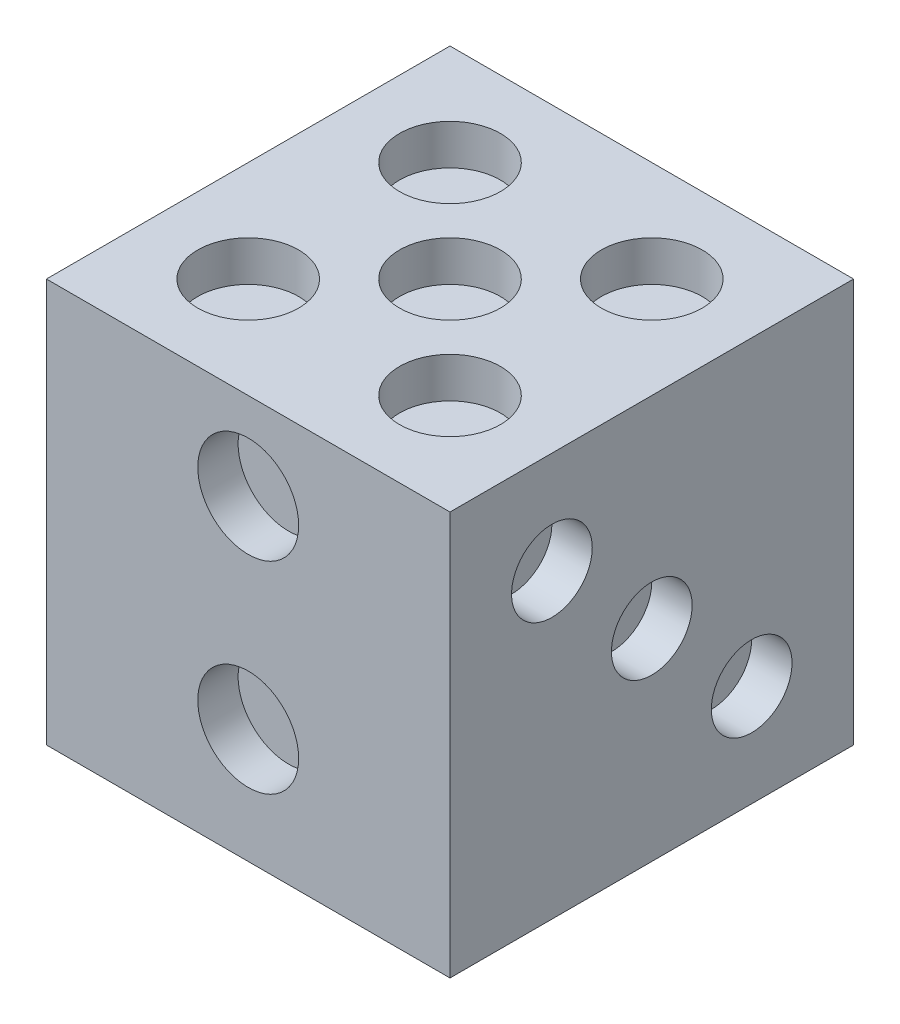
ISO-10303-21;
HEADER;
FILE_DESCRIPTION(('STEP AP214'),'2;1');
FILE_NAME('part.step','',(''),(''),'','','');
FILE_SCHEMA(('AUTOMOTIVE_DESIGN { 1 0 10303 214 1 1 1 1 }'));
ENDSEC;
DATA;
#1=APPLICATION_CONTEXT('core data for automotive mechanical design processes');
#2=APPLICATION_PROTOCOL_DEFINITION('international standard','automotive_design',2000,#1);
#3=PRODUCT_CONTEXT('',#1,'mechanical');
#4=PRODUCT('Part','Part','',(#3));
#5=PRODUCT_RELATED_PRODUCT_CATEGORY('part','',(#4));
#6=PRODUCT_DEFINITION_FORMATION('','',#4);
#7=PRODUCT_DEFINITION_CONTEXT('part definition',#1,'design');
#8=PRODUCT_DEFINITION('design','',#6,#7);
#9=PRODUCT_DEFINITION_SHAPE('','',#8);
#10=(LENGTH_UNIT() NAMED_UNIT(*) SI_UNIT(.MILLI.,.METRE.));
#11=(NAMED_UNIT(*) PLANE_ANGLE_UNIT() SI_UNIT($,.RADIAN.));
#12=(NAMED_UNIT(*) SI_UNIT($,.STERADIAN.) SOLID_ANGLE_UNIT());
#13=UNCERTAINTY_MEASURE_WITH_UNIT(LENGTH_MEASURE(1.E-05),#10,'distance_accuracy_value','');
#14=(GEOMETRIC_REPRESENTATION_CONTEXT(3) GLOBAL_UNCERTAINTY_ASSIGNED_CONTEXT((#13)) GLOBAL_UNIT_ASSIGNED_CONTEXT((#10,
#11,#12)) REPRESENTATION_CONTEXT('',''));
#15=CARTESIAN_POINT('',(0.,0.,0.));
#16=DIRECTION('',(0.,0.,1.));
#17=DIRECTION('',(1.,0.,0.));
#18=AXIS2_PLACEMENT_3D('',#15,#16,#17);
#19=CARTESIAN_POINT('',(-40.9403691906033,100.,52.2269008412575));
#20=DIRECTION('',(-1.,0.,0.));
#21=DIRECTION('',(0.,0.,1.));
#22=AXIS2_PLACEMENT_3D('',#19,#20,#21);
#23=PLANE('',#22);
#24=CARTESIAN_POINT('',(-40.9403691906033,73.7094093763666,-22.7730991587426));
#25=DIRECTION('',(-1.,0.,0.));
#26=DIRECTION('',(0.,0.,1.));
#27=AXIS2_PLACEMENT_3D('',#24,#25,#26);
#28=CIRCLE('',#27,12.);
#29=CARTESIAN_POINT('',(-40.9403691906033,73.7094093763666,-10.7730991587426));
#30=VERTEX_POINT('',#29);
#31=EDGE_CURVE('E143',#30,#30,#28,.T.);
#32=ORIENTED_EDGE('',*,*,#31,.F.);
#33=EDGE_LOOP('',(#32));
#34=FACE_BOUND('',#33,.T.);
#35=CARTESIAN_POINT('',(-40.9403691906033,75.,2.22690084125745));
#36=DIRECTION('',(-1.,0.,0.));
#37=DIRECTION('',(0.,0.,1.));
#38=AXIS2_PLACEMENT_3D('',#35,#36,#37);
#39=CIRCLE('',#38,12.);
#40=CARTESIAN_POINT('',(-40.9403691906033,75.,14.2269008412575));
#41=VERTEX_POINT('',#40);
#42=EDGE_CURVE('E147',#41,#41,#39,.T.);
#43=ORIENTED_EDGE('',*,*,#42,.F.);
#44=EDGE_LOOP('',(#43));
#45=FACE_BOUND('',#44,.T.);
#46=CARTESIAN_POINT('',(-40.9403691906033,75.,27.2269008412575));
#47=DIRECTION('',(-1.,0.,0.));
#48=DIRECTION('',(0.,0.,1.));
#49=AXIS2_PLACEMENT_3D('',#46,#47,#48);
#50=CIRCLE('',#49,12.);
#51=CARTESIAN_POINT('',(-40.9403691906033,75.,39.2269008412574));
#52=VERTEX_POINT('',#51);
#53=EDGE_CURVE('E151',#52,#52,#50,.T.);
#54=ORIENTED_EDGE('',*,*,#53,.F.);
#55=EDGE_LOOP('',(#54));
#56=FACE_BOUND('',#55,.T.);
#57=CARTESIAN_POINT('',(-40.9403691906033,25.,27.2269008412575));
#58=DIRECTION('',(-1.,0.,0.));
#59=DIRECTION('',(0.,0.,1.));
#60=AXIS2_PLACEMENT_3D('',#57,#58,#59);
#61=CIRCLE('',#60,12.);
#62=CARTESIAN_POINT('',(-40.9403691906033,25.,39.2269008412574));
#63=VERTEX_POINT('',#62);
#64=EDGE_CURVE('E155',#63,#63,#61,.T.);
#65=ORIENTED_EDGE('',*,*,#64,.F.);
#66=EDGE_LOOP('',(#65));
#67=FACE_BOUND('',#66,.T.);
#68=CARTESIAN_POINT('',(-40.9403691906033,25.,2.22690084125745));
#69=DIRECTION('',(-1.,0.,0.));
#70=DIRECTION('',(0.,0.,1.));
#71=AXIS2_PLACEMENT_3D('',#68,#69,#70);
#72=CIRCLE('',#71,12.);
#73=CARTESIAN_POINT('',(-40.9403691906033,25.,14.2269008412575));
#74=VERTEX_POINT('',#73);
#75=EDGE_CURVE('E159',#74,#74,#72,.T.);
#76=ORIENTED_EDGE('',*,*,#75,.F.);
#77=EDGE_LOOP('',(#76));
#78=FACE_BOUND('',#77,.T.);
#79=CARTESIAN_POINT('',(-40.9403691906033,25.,-22.7730991587426));
#80=DIRECTION('',(-1.,0.,0.));
#81=DIRECTION('',(0.,0.,1.));
#82=AXIS2_PLACEMENT_3D('',#79,#80,#81);
#83=CIRCLE('',#82,12.);
#84=CARTESIAN_POINT('',(-40.9403691906033,25.,-10.7730991587426));
#85=VERTEX_POINT('',#84);
#86=EDGE_CURVE('E162',#85,#85,#83,.T.);
#87=ORIENTED_EDGE('',*,*,#86,.F.);
#88=EDGE_LOOP('',(#87));
#89=FACE_BOUND('',#88,.T.);
#90=DIRECTION('',(0.,0.,-1.));
#91=VECTOR('',#90,1.);
#92=CARTESIAN_POINT('',(-40.9403691906033,0.,52.2269008412575));
#93=LINE('',#92,#91);
#94=CARTESIAN_POINT('',(-40.9403691906033,0.,52.2269008412575));
#95=VERTEX_POINT('',#94);
#96=CARTESIAN_POINT('',(-40.9403691906033,0.,-47.7730991587426));
#97=VERTEX_POINT('',#96);
#98=EDGE_CURVE('E116',#95,#97,#93,.T.);
#99=ORIENTED_EDGE('',*,*,#98,.F.);
#100=DIRECTION('',(0.,-1.,0.));
#101=VECTOR('',#100,1.);
#102=CARTESIAN_POINT('',(-40.9403691906033,100.,52.2269008412575));
#103=LINE('',#102,#101);
#104=CARTESIAN_POINT('',(-40.9403691906033,100.,52.2269008412575));
#105=VERTEX_POINT('',#104);
#106=EDGE_CURVE('E12',#105,#95,#103,.T.);
#107=ORIENTED_EDGE('',*,*,#106,.F.);
#108=DIRECTION('',(0.,0.,-1.));
#109=VECTOR('',#108,1.);
#110=CARTESIAN_POINT('',(-40.9403691906033,100.,52.2269008412575));
#111=LINE('',#110,#109);
#112=CARTESIAN_POINT('',(-40.9403691906033,100.,-47.7730991587426));
#113=VERTEX_POINT('',#112);
#114=EDGE_CURVE('E108',#105,#113,#111,.T.);
#115=ORIENTED_EDGE('',*,*,#114,.T.);
#116=DIRECTION('',(0.,-1.,0.));
#117=VECTOR('',#116,1.);
#118=CARTESIAN_POINT('',(-40.9403691906033,100.,-47.7730991587426));
#119=LINE('',#118,#117);
#120=EDGE_CURVE('E47',#113,#97,#119,.T.);
#121=ORIENTED_EDGE('',*,*,#120,.T.);
#122=EDGE_LOOP('',(#99,#107,#115,#121));
#123=FACE_BOUND('',#122,.T.);
#124=ADVANCED_FACE('F44',(#34,#45,#56,#67,#78,#89,#123),#23,.T.);
#125=CARTESIAN_POINT('',(-40.9403691906033,100.,52.2269008412575));
#126=DIRECTION('',(0.,0.,-1.));
#127=DIRECTION('',(-1.,0.,0.));
#128=AXIS2_PLACEMENT_3D('',#125,#126,#127);
#129=PLANE('',#128);
#130=CARTESIAN_POINT('',(9.05963080939674,78.3884909162886,52.2269008412575));
#131=DIRECTION('',(0.,0.,1.));
#132=DIRECTION('',(1.,0.,0.));
#133=AXIS2_PLACEMENT_3D('',#130,#131,#132);
#134=CIRCLE('',#133,12.5);
#135=CARTESIAN_POINT('',(21.5596308093967,78.3884909162886,52.2269008412575));
#136=VERTEX_POINT('',#135);
#137=EDGE_CURVE('E181',#136,#136,#134,.T.);
#138=ORIENTED_EDGE('',*,*,#137,.F.);
#139=EDGE_LOOP('',(#138));
#140=FACE_BOUND('',#139,.T.);
#141=CARTESIAN_POINT('',(9.05963080939674,28.3884909162886,52.2269008412575));
#142=DIRECTION('',(0.,0.,1.));
#143=DIRECTION('',(1.,0.,0.));
#144=AXIS2_PLACEMENT_3D('',#141,#142,#143);
#145=CIRCLE('',#144,12.5);
#146=CARTESIAN_POINT('',(21.5596308093967,28.3884909162886,52.2269008412575));
#147=VERTEX_POINT('',#146);
#148=EDGE_CURVE('E170',#147,#147,#145,.T.);
#149=ORIENTED_EDGE('',*,*,#148,.F.);
#150=EDGE_LOOP('',(#149));
#151=FACE_BOUND('',#150,.T.);
#152=DIRECTION('',(1.,0.,0.));
#153=VECTOR('',#152,1.);
#154=CARTESIAN_POINT('',(-40.9403691906033,0.,52.2269008412575));
#155=LINE('',#154,#153);
#156=CARTESIAN_POINT('',(59.0596308093967,0.,52.2269008412575));
#157=VERTEX_POINT('',#156);
#158=EDGE_CURVE('E78',#95,#157,#155,.T.);
#159=ORIENTED_EDGE('',*,*,#158,.T.);
#160=DIRECTION('',(0.,-1.,0.));
#161=VECTOR('',#160,1.);
#162=CARTESIAN_POINT('',(59.0596308093967,100.,52.2269008412575));
#163=LINE('',#162,#161);
#164=CARTESIAN_POINT('',(59.0596308093967,100.,52.2269008412575));
#165=VERTEX_POINT('',#164);
#166=EDGE_CURVE('E54',#165,#157,#163,.T.);
#167=ORIENTED_EDGE('',*,*,#166,.F.);
#168=DIRECTION('',(1.,0.,0.));
#169=VECTOR('',#168,1.);
#170=CARTESIAN_POINT('',(-40.9403691906033,100.,52.2269008412575));
#171=LINE('',#170,#169);
#172=EDGE_CURVE('E95',#105,#165,#171,.T.);
#173=ORIENTED_EDGE('',*,*,#172,.F.);
#174=ORIENTED_EDGE('',*,*,#106,.T.);
#175=EDGE_LOOP('',(#159,#167,#173,#174));
#176=FACE_BOUND('',#175,.T.);
#177=ADVANCED_FACE('F133',(#140,#151,#176),#129,.F.);
#178=CARTESIAN_POINT('',(59.0596308093967,100.,52.2269008412575));
#179=DIRECTION('',(-1.,0.,0.));
#180=DIRECTION('',(0.,0.,1.));
#181=AXIS2_PLACEMENT_3D('',#178,#179,#180);
#182=PLANE('',#181);
#183=CARTESIAN_POINT('',(59.0596308093967,74.7487373415292,26.9756381827866));
#184=DIRECTION('',(1.,0.,0.));
#185=DIRECTION('',(0.,0.,-1.));
#186=AXIS2_PLACEMENT_3D('',#183,#184,#185);
#187=CIRCLE('',#186,10.);
#188=CARTESIAN_POINT('',(59.0596308093967,74.7487373415292,16.9756381827866));
#189=VERTEX_POINT('',#188);
#190=EDGE_CURVE('E260',#189,#189,#187,.T.);
#191=ORIENTED_EDGE('',*,*,#190,.F.);
#192=EDGE_LOOP('',(#191));
#193=FACE_BOUND('',#192,.T.);
#194=CARTESIAN_POINT('',(59.0596308093967,25.2512626584708,-22.5218365002717));
#195=DIRECTION('',(1.,0.,0.));
#196=DIRECTION('',(0.,0.,-1.));
#197=AXIS2_PLACEMENT_3D('',#194,#195,#196);
#198=CIRCLE('',#197,10.);
#199=CARTESIAN_POINT('',(59.0596308093967,25.2512626584708,-32.5218365002717));
#200=VERTEX_POINT('',#199);
#201=EDGE_CURVE('E269',#200,#200,#198,.T.);
#202=ORIENTED_EDGE('',*,*,#201,.F.);
#203=EDGE_LOOP('',(#202));
#204=FACE_BOUND('',#203,.T.);
#205=CARTESIAN_POINT('',(59.0596308093967,50.,2.22690084125744));
#206=DIRECTION('',(1.,0.,0.));
#207=DIRECTION('',(0.,0.,-1.));
#208=AXIS2_PLACEMENT_3D('',#205,#206,#207);
#209=CIRCLE('',#208,10.);
#210=CARTESIAN_POINT('',(59.0596308093967,50.,-7.77309915874256));
#211=VERTEX_POINT('',#210);
#212=EDGE_CURVE('E268',#211,#211,#209,.T.);
#213=ORIENTED_EDGE('',*,*,#212,.F.);
#214=EDGE_LOOP('',(#213));
#215=FACE_BOUND('',#214,.T.);
#216=DIRECTION('',(0.,0.,-1.));
#217=VECTOR('',#216,1.);
#218=CARTESIAN_POINT('',(59.0596308093967,0.,52.2269008412575));
#219=LINE('',#218,#217);
#220=CARTESIAN_POINT('',(59.0596308093967,0.,-47.7730991587426));
#221=VERTEX_POINT('',#220);
#222=EDGE_CURVE('E103',#157,#221,#219,.T.);
#223=ORIENTED_EDGE('',*,*,#222,.T.);
#224=DIRECTION('',(0.,-1.,0.));
#225=VECTOR('',#224,1.);
#226=CARTESIAN_POINT('',(59.0596308093967,100.,-47.7730991587426));
#227=LINE('',#226,#225);
#228=CARTESIAN_POINT('',(59.0596308093967,100.,-47.7730991587426));
#229=VERTEX_POINT('',#228);
#230=EDGE_CURVE('E100',#229,#221,#227,.T.);
#231=ORIENTED_EDGE('',*,*,#230,.F.);
#232=DIRECTION('',(0.,0.,-1.));
#233=VECTOR('',#232,1.);
#234=CARTESIAN_POINT('',(59.0596308093967,100.,52.2269008412575));
#235=LINE('',#234,#233);
#236=EDGE_CURVE('E90',#165,#229,#235,.T.);
#237=ORIENTED_EDGE('',*,*,#236,.F.);
#238=ORIENTED_EDGE('',*,*,#166,.T.);
#239=EDGE_LOOP('',(#223,#231,#237,#238));
#240=FACE_BOUND('',#239,.T.);
#241=ADVANCED_FACE('F101',(#193,#204,#215,#240),#182,.F.);
#242=CARTESIAN_POINT('',(-40.9403691906033,100.,-47.7730991587426));
#243=DIRECTION('',(0.,0.,-1.));
#244=DIRECTION('',(-1.,0.,0.));
#245=AXIS2_PLACEMENT_3D('',#242,#243,#244);
#246=PLANE('',#245);
#247=CARTESIAN_POINT('',(-15.9403691906033,75.,-47.7730991587426));
#248=DIRECTION('',(0.,0.,-1.));
#249=DIRECTION('',(-1.,0.,0.));
#250=AXIS2_PLACEMENT_3D('',#247,#248,#249);
#251=CIRCLE('',#250,12.5);
#252=CARTESIAN_POINT('',(-28.4403691906033,75.,-47.7730991587426));
#253=VERTEX_POINT('',#252);
#254=EDGE_CURVE('E245',#253,#253,#251,.T.);
#255=ORIENTED_EDGE('',*,*,#254,.F.);
#256=EDGE_LOOP('',(#255));
#257=FACE_BOUND('',#256,.T.);
#258=CARTESIAN_POINT('',(34.0596308093967,25.,-47.7730991587426));
#259=DIRECTION('',(0.,0.,-1.));
#260=DIRECTION('',(-1.,0.,0.));
#261=AXIS2_PLACEMENT_3D('',#258,#259,#260);
#262=CIRCLE('',#261,12.5);
#263=CARTESIAN_POINT('',(21.5596308093967,25.,-47.7730991587426));
#264=VERTEX_POINT('',#263);
#265=EDGE_CURVE('E236',#264,#264,#262,.T.);
#266=ORIENTED_EDGE('',*,*,#265,.F.);
#267=EDGE_LOOP('',(#266));
#268=FACE_BOUND('',#267,.T.);
#269=CARTESIAN_POINT('',(-15.9403691906033,25.,-47.7730991587426));
#270=DIRECTION('',(0.,0.,-1.));
#271=DIRECTION('',(-1.,0.,0.));
#272=AXIS2_PLACEMENT_3D('',#269,#270,#271);
#273=CIRCLE('',#272,12.5);
#274=CARTESIAN_POINT('',(-28.4403691906033,25.,-47.7730991587426));
#275=VERTEX_POINT('',#274);
#276=EDGE_CURVE('E228',#275,#275,#273,.T.);
#277=ORIENTED_EDGE('',*,*,#276,.F.);
#278=EDGE_LOOP('',(#277));
#279=FACE_BOUND('',#278,.T.);
#280=CARTESIAN_POINT('',(34.0596308093967,75.,-47.7730991587426));
#281=DIRECTION('',(0.,0.,-1.));
#282=DIRECTION('',(-1.,0.,0.));
#283=AXIS2_PLACEMENT_3D('',#280,#281,#282);
#284=CIRCLE('',#283,12.5);
#285=CARTESIAN_POINT('',(21.5596308093967,75.,-47.7730991587426));
#286=VERTEX_POINT('',#285);
#287=EDGE_CURVE('E244',#286,#286,#284,.T.);
#288=ORIENTED_EDGE('',*,*,#287,.F.);
#289=EDGE_LOOP('',(#288));
#290=FACE_BOUND('',#289,.T.);
#291=DIRECTION('',(1.,0.,0.));
#292=VECTOR('',#291,1.);
#293=CARTESIAN_POINT('',(-40.9403691906033,0.,-47.7730991587426));
#294=LINE('',#293,#292);
#295=EDGE_CURVE('E120',#97,#221,#294,.T.);
#296=ORIENTED_EDGE('',*,*,#295,.F.);
#297=ORIENTED_EDGE('',*,*,#120,.F.);
#298=DIRECTION('',(1.,0.,0.));
#299=VECTOR('',#298,1.);
#300=CARTESIAN_POINT('',(-40.9403691906033,100.,-47.7730991587426));
#301=LINE('',#300,#299);
#302=EDGE_CURVE('E94',#113,#229,#301,.T.);
#303=ORIENTED_EDGE('',*,*,#302,.T.);
#304=ORIENTED_EDGE('',*,*,#230,.T.);
#305=EDGE_LOOP('',(#296,#297,#303,#304));
#306=FACE_BOUND('',#305,.T.);
#307=ADVANCED_FACE('F106',(#257,#268,#279,#290,#306),#246,.T.);
#308=CARTESIAN_POINT('',(0.,100.,0.));
#309=DIRECTION('',(0.,-1.,0.));
#310=DIRECTION('',(0.,0.,-1.));
#311=AXIS2_PLACEMENT_3D('',#308,#309,#310);
#312=PLANE('',#311);
#313=CARTESIAN_POINT('',(9.05963080939674,100.,2.22690084125745));
#314=DIRECTION('',(0.,1.,0.));
#315=DIRECTION('',(0.,0.,1.));
#316=AXIS2_PLACEMENT_3D('',#313,#314,#315);
#317=CIRCLE('',#316,12.5);
#318=CARTESIAN_POINT('',(9.05963080939674,100.,14.7269008412575));
#319=VERTEX_POINT('',#318);
#320=EDGE_CURVE('E208',#319,#319,#317,.T.);
#321=ORIENTED_EDGE('',*,*,#320,.F.);
#322=EDGE_LOOP('',(#321));
#323=FACE_BOUND('',#322,.T.);
#324=CARTESIAN_POINT('',(34.0596308093967,100.,-22.7730991587425));
#325=DIRECTION('',(0.,1.,0.));
#326=DIRECTION('',(0.,0.,1.));
#327=AXIS2_PLACEMENT_3D('',#324,#325,#326);
#328=CIRCLE('',#327,12.5);
#329=CARTESIAN_POINT('',(34.0596308093967,100.,-10.2730991587425));
#330=VERTEX_POINT('',#329);
#331=EDGE_CURVE('E216',#330,#330,#328,.T.);
#332=ORIENTED_EDGE('',*,*,#331,.F.);
#333=EDGE_LOOP('',(#332));
#334=FACE_BOUND('',#333,.T.);
#335=CARTESIAN_POINT('',(-15.9403691906033,100.,-22.7730991587425));
#336=DIRECTION('',(0.,1.,0.));
#337=DIRECTION('',(0.,0.,1.));
#338=AXIS2_PLACEMENT_3D('',#335,#336,#337);
#339=CIRCLE('',#338,12.5);
#340=CARTESIAN_POINT('',(-15.9403691906033,100.,-10.2730991587425));
#341=VERTEX_POINT('',#340);
#342=EDGE_CURVE('E192',#341,#341,#339,.T.);
#343=ORIENTED_EDGE('',*,*,#342,.F.);
#344=EDGE_LOOP('',(#343));
#345=FACE_BOUND('',#344,.T.);
#346=CARTESIAN_POINT('',(-15.9403691906033,100.,27.2269008412575));
#347=DIRECTION('',(0.,1.,0.));
#348=DIRECTION('',(0.,0.,1.));
#349=AXIS2_PLACEMENT_3D('',#346,#347,#348);
#350=CIRCLE('',#349,12.5);
#351=CARTESIAN_POINT('',(-15.9403691906033,100.,39.7269008412575));
#352=VERTEX_POINT('',#351);
#353=EDGE_CURVE('E201',#352,#352,#350,.T.);
#354=ORIENTED_EDGE('',*,*,#353,.F.);
#355=EDGE_LOOP('',(#354));
#356=FACE_BOUND('',#355,.T.);
#357=CARTESIAN_POINT('',(34.0596308093967,100.,27.2269008412575));
#358=DIRECTION('',(0.,1.,0.));
#359=DIRECTION('',(0.,0.,1.));
#360=AXIS2_PLACEMENT_3D('',#357,#358,#359);
#361=CIRCLE('',#360,12.5);
#362=CARTESIAN_POINT('',(34.0596308093967,100.,39.7269008412575));
#363=VERTEX_POINT('',#362);
#364=EDGE_CURVE('E220',#363,#363,#361,.T.);
#365=ORIENTED_EDGE('',*,*,#364,.F.);
#366=EDGE_LOOP('',(#365));
#367=FACE_BOUND('',#366,.T.);
#368=ORIENTED_EDGE('',*,*,#114,.F.);
#369=ORIENTED_EDGE('',*,*,#172,.T.);
#370=ORIENTED_EDGE('',*,*,#236,.T.);
#371=ORIENTED_EDGE('',*,*,#302,.F.);
#372=EDGE_LOOP('',(#368,#369,#370,#371));
#373=FACE_BOUND('',#372,.T.);
#374=ADVANCED_FACE('F93',(#323,#334,#345,#356,#367,#373),#312,.F.);
#375=CARTESIAN_POINT('',(0.,0.,0.));
#376=DIRECTION('',(0.,-1.,0.));
#377=DIRECTION('',(0.,0.,-1.));
#378=AXIS2_PLACEMENT_3D('',#375,#376,#377);
#379=PLANE('',#378);
#380=CARTESIAN_POINT('',(10.5377049927071,0.,2.7055647747849));
#381=DIRECTION('',(0.,-1.,0.));
#382=DIRECTION('',(0.,0.,-1.));
#383=AXIS2_PLACEMENT_3D('',#380,#381,#382);
#384=CIRCLE('',#383,15.);
#385=CARTESIAN_POINT('',(10.5377049927071,0.,-12.2944352252151));
#386=VERTEX_POINT('',#385);
#387=EDGE_CURVE('E284',#386,#386,#384,.T.);
#388=ORIENTED_EDGE('',*,*,#387,.F.);
#389=EDGE_LOOP('',(#388));
#390=FACE_BOUND('',#389,.T.);
#391=ORIENTED_EDGE('',*,*,#98,.T.);
#392=ORIENTED_EDGE('',*,*,#295,.T.);
#393=ORIENTED_EDGE('',*,*,#222,.F.);
#394=ORIENTED_EDGE('',*,*,#158,.F.);
#395=EDGE_LOOP('',(#391,#392,#393,#394));
#396=FACE_BOUND('',#395,.T.);
#397=ADVANCED_FACE('F130',(#390,#396),#379,.T.);
#398=CARTESIAN_POINT('',(10.5377049927071,10.,2.7055647747849));
#399=DIRECTION('',(0.,-1.,0.));
#400=DIRECTION('',(0.,0.,-1.));
#401=AXIS2_PLACEMENT_3D('',#398,#399,#400);
#402=CYLINDRICAL_SURFACE('',#401,15.);
#403=CARTESIAN_POINT('',(10.5377049927071,10.,2.7055647747849));
#404=DIRECTION('',(0.,-1.,0.));
#405=DIRECTION('',(0.,0.,-1.));
#406=AXIS2_PLACEMENT_3D('',#403,#404,#405);
#407=CIRCLE('',#406,15.);
#408=CARTESIAN_POINT('',(10.5377049927071,10.,-12.2944352252151));
#409=VERTEX_POINT('',#408);
#410=EDGE_CURVE('E121',#409,#409,#407,.T.);
#411=ORIENTED_EDGE('',*,*,#410,.F.);
#412=EDGE_LOOP('',(#411));
#413=FACE_BOUND('',#412,.T.);
#414=ORIENTED_EDGE('',*,*,#387,.T.);
#415=EDGE_LOOP('',(#414));
#416=FACE_BOUND('',#415,.T.);
#417=ADVANCED_FACE('F294',(#413,#416),#402,.F.);
#418=CARTESIAN_POINT('',(10.5377049927071,10.,2.7055647747849));
#419=DIRECTION('',(0.,-1.,0.));
#420=DIRECTION('',(0.,0.,-1.));
#421=AXIS2_PLACEMENT_3D('',#418,#419,#420);
#422=PLANE('',#421);
#423=ORIENTED_EDGE('',*,*,#410,.T.);
#424=EDGE_LOOP('',(#423));
#425=FACE_BOUND('',#424,.T.);
#426=ADVANCED_FACE('F302',(#425),#422,.T.);
#427=CARTESIAN_POINT('',(49.0596308093967,50.,2.22690084125744));
#428=DIRECTION('',(1.,0.,0.));
#429=DIRECTION('',(0.,0.,-1.));
#430=AXIS2_PLACEMENT_3D('',#427,#428,#429);
#431=CYLINDRICAL_SURFACE('',#430,10.);
#432=CARTESIAN_POINT('',(49.0596308093967,50.,2.22690084125744));
#433=DIRECTION('',(1.,0.,0.));
#434=DIRECTION('',(0.,0.,-1.));
#435=AXIS2_PLACEMENT_3D('',#432,#433,#434);
#436=CIRCLE('',#435,10.);
#437=CARTESIAN_POINT('',(49.0596308093967,50.,-7.77309915874256));
#438=VERTEX_POINT('',#437);
#439=EDGE_CURVE('E280',#438,#438,#436,.T.);
#440=ORIENTED_EDGE('',*,*,#439,.F.);
#441=EDGE_LOOP('',(#440));
#442=FACE_BOUND('',#441,.T.);
#443=ORIENTED_EDGE('',*,*,#212,.T.);
#444=EDGE_LOOP('',(#443));
#445=FACE_BOUND('',#444,.T.);
#446=ADVANCED_FACE('F355',(#442,#445),#431,.F.);
#447=CARTESIAN_POINT('',(49.0596308093967,50.,2.22690084125744));
#448=DIRECTION('',(1.,0.,0.));
#449=DIRECTION('',(0.,0.,-1.));
#450=AXIS2_PLACEMENT_3D('',#447,#448,#449);
#451=PLANE('',#450);
#452=ORIENTED_EDGE('',*,*,#439,.T.);
#453=EDGE_LOOP('',(#452));
#454=FACE_BOUND('',#453,.T.);
#455=ADVANCED_FACE('F347',(#454),#451,.T.);
#456=CARTESIAN_POINT('',(49.0596308093967,25.2512626584708,-22.5218365002717));
#457=DIRECTION('',(1.,0.,0.));
#458=DIRECTION('',(0.,0.,-1.));
#459=AXIS2_PLACEMENT_3D('',#456,#457,#458);
#460=CYLINDRICAL_SURFACE('',#459,10.);
#461=CARTESIAN_POINT('',(49.0596308093967,25.2512626584708,-22.5218365002717));
#462=DIRECTION('',(1.,0.,0.));
#463=DIRECTION('',(0.,0.,-1.));
#464=AXIS2_PLACEMENT_3D('',#461,#462,#463);
#465=CIRCLE('',#464,10.);
#466=CARTESIAN_POINT('',(49.0596308093967,25.2512626584708,-32.5218365002717));
#467=VERTEX_POINT('',#466);
#468=EDGE_CURVE('E264',#467,#467,#465,.T.);
#469=ORIENTED_EDGE('',*,*,#468,.F.);
#470=EDGE_LOOP('',(#469));
#471=FACE_BOUND('',#470,.T.);
#472=ORIENTED_EDGE('',*,*,#201,.T.);
#473=EDGE_LOOP('',(#472));
#474=FACE_BOUND('',#473,.T.);
#475=ADVANCED_FACE('F344',(#471,#474),#460,.F.);
#476=CARTESIAN_POINT('',(49.0596308093967,25.2512626584708,-22.5218365002717));
#477=DIRECTION('',(1.,0.,0.));
#478=DIRECTION('',(0.,0.,-1.));
#479=AXIS2_PLACEMENT_3D('',#476,#477,#478);
#480=PLANE('',#479);
#481=ORIENTED_EDGE('',*,*,#468,.T.);
#482=EDGE_LOOP('',(#481));
#483=FACE_BOUND('',#482,.T.);
#484=ADVANCED_FACE('F341',(#483),#480,.T.);
#485=CARTESIAN_POINT('',(49.0596308093967,74.7487373415292,26.9756381827866));
#486=DIRECTION('',(1.,0.,0.));
#487=DIRECTION('',(0.,0.,-1.));
#488=AXIS2_PLACEMENT_3D('',#485,#486,#487);
#489=CYLINDRICAL_SURFACE('',#488,10.);
#490=CARTESIAN_POINT('',(49.0596308093967,74.7487373415292,26.9756381827866));
#491=DIRECTION('',(1.,0.,0.));
#492=DIRECTION('',(0.,0.,-1.));
#493=AXIS2_PLACEMENT_3D('',#490,#491,#492);
#494=CIRCLE('',#493,10.);
#495=CARTESIAN_POINT('',(49.0596308093967,74.7487373415292,16.9756381827866));
#496=VERTEX_POINT('',#495);
#497=EDGE_CURVE('E273',#496,#496,#494,.T.);
#498=ORIENTED_EDGE('',*,*,#497,.F.);
#499=EDGE_LOOP('',(#498));
#500=FACE_BOUND('',#499,.T.);
#501=ORIENTED_EDGE('',*,*,#190,.T.);
#502=EDGE_LOOP('',(#501));
#503=FACE_BOUND('',#502,.T.);
#504=ADVANCED_FACE('F335',(#500,#503),#489,.F.);
#505=CARTESIAN_POINT('',(49.0596308093967,74.7487373415292,26.9756381827866));
#506=DIRECTION('',(1.,0.,0.));
#507=DIRECTION('',(0.,0.,-1.));
#508=AXIS2_PLACEMENT_3D('',#505,#506,#507);
#509=PLANE('',#508);
#510=ORIENTED_EDGE('',*,*,#497,.T.);
#511=EDGE_LOOP('',(#510));
#512=FACE_BOUND('',#511,.T.);
#513=ADVANCED_FACE('F325',(#512),#509,.T.);
#514=CARTESIAN_POINT('',(34.0596308093967,75.,-37.7730991587426));
#515=DIRECTION('',(0.,0.,-1.));
#516=DIRECTION('',(-1.,0.,0.));
#517=AXIS2_PLACEMENT_3D('',#514,#515,#516);
#518=CYLINDRICAL_SURFACE('',#517,12.5);
#519=CARTESIAN_POINT('',(34.0596308093967,75.,-37.7730991587426));
#520=DIRECTION('',(0.,0.,-1.));
#521=DIRECTION('',(-1.,0.,0.));
#522=AXIS2_PLACEMENT_3D('',#519,#520,#521);
#523=CIRCLE('',#522,12.5);
#524=CARTESIAN_POINT('',(21.5596308093967,75.,-37.7730991587426));
#525=VERTEX_POINT('',#524);
#526=EDGE_CURVE('E256',#525,#525,#523,.T.);
#527=ORIENTED_EDGE('',*,*,#526,.F.);
#528=EDGE_LOOP('',(#527));
#529=FACE_BOUND('',#528,.T.);
#530=ORIENTED_EDGE('',*,*,#287,.T.);
#531=EDGE_LOOP('',(#530));
#532=FACE_BOUND('',#531,.T.);
#533=ADVANCED_FACE('F322',(#529,#532),#518,.F.);
#534=CARTESIAN_POINT('',(0.,0.,-37.7730991587426));
#535=DIRECTION('',(0.,0.,-1.));
#536=DIRECTION('',(-1.,0.,0.));
#537=AXIS2_PLACEMENT_3D('',#534,#535,#536);
#538=PLANE('',#537);
#539=ORIENTED_EDGE('',*,*,#526,.T.);
#540=EDGE_LOOP('',(#539));
#541=FACE_BOUND('',#540,.T.);
#542=ADVANCED_FACE('F324',(#541),#538,.T.);
#543=CARTESIAN_POINT('',(-15.9403691906033,25.,-37.7730991587426));
#544=DIRECTION('',(0.,0.,-1.));
#545=DIRECTION('',(-1.,0.,0.));
#546=AXIS2_PLACEMENT_3D('',#543,#544,#545);
#547=CYLINDRICAL_SURFACE('',#546,12.5);
#548=CARTESIAN_POINT('',(-15.9403691906033,25.,-37.7730991587426));
#549=DIRECTION('',(0.,0.,-1.));
#550=DIRECTION('',(-1.,0.,0.));
#551=AXIS2_PLACEMENT_3D('',#548,#549,#550);
#552=CIRCLE('',#551,12.5);
#553=CARTESIAN_POINT('',(-28.4403691906033,25.,-37.7730991587426));
#554=VERTEX_POINT('',#553);
#555=EDGE_CURVE('E232',#554,#554,#552,.T.);
#556=ORIENTED_EDGE('',*,*,#555,.F.);
#557=EDGE_LOOP('',(#556));
#558=FACE_BOUND('',#557,.T.);
#559=ORIENTED_EDGE('',*,*,#276,.T.);
#560=EDGE_LOOP('',(#559));
#561=FACE_BOUND('',#560,.T.);
#562=ADVANCED_FACE('F332',(#558,#561),#547,.F.);
#563=CARTESIAN_POINT('',(0.,0.,-37.7730991587426));
#564=DIRECTION('',(0.,0.,-1.));
#565=DIRECTION('',(-1.,0.,0.));
#566=AXIS2_PLACEMENT_3D('',#563,#564,#565);
#567=PLANE('',#566);
#568=ORIENTED_EDGE('',*,*,#555,.T.);
#569=EDGE_LOOP('',(#568));
#570=FACE_BOUND('',#569,.T.);
#571=ADVANCED_FACE('F418',(#570),#567,.T.);
#572=CARTESIAN_POINT('',(34.0596308093967,25.,-37.7730991587426));
#573=DIRECTION('',(0.,0.,-1.));
#574=DIRECTION('',(-1.,0.,0.));
#575=AXIS2_PLACEMENT_3D('',#572,#573,#574);
#576=CYLINDRICAL_SURFACE('',#575,12.5);
#577=CARTESIAN_POINT('',(34.0596308093967,25.,-37.7730991587426));
#578=DIRECTION('',(0.,0.,-1.));
#579=DIRECTION('',(-1.,0.,0.));
#580=AXIS2_PLACEMENT_3D('',#577,#578,#579);
#581=CIRCLE('',#580,12.5);
#582=CARTESIAN_POINT('',(21.5596308093967,25.,-37.7730991587426));
#583=VERTEX_POINT('',#582);
#584=EDGE_CURVE('E249',#583,#583,#581,.T.);
#585=ORIENTED_EDGE('',*,*,#584,.F.);
#586=EDGE_LOOP('',(#585));
#587=FACE_BOUND('',#586,.T.);
#588=ORIENTED_EDGE('',*,*,#265,.T.);
#589=EDGE_LOOP('',(#588));
#590=FACE_BOUND('',#589,.T.);
#591=ADVANCED_FACE('F429',(#587,#590),#576,.F.);
#592=CARTESIAN_POINT('',(0.,0.,-37.7730991587426));
#593=DIRECTION('',(0.,0.,-1.));
#594=DIRECTION('',(-1.,0.,0.));
#595=AXIS2_PLACEMENT_3D('',#592,#593,#594);
#596=PLANE('',#595);
#597=ORIENTED_EDGE('',*,*,#584,.T.);
#598=EDGE_LOOP('',(#597));
#599=FACE_BOUND('',#598,.T.);
#600=ADVANCED_FACE('F439',(#599),#596,.T.);
#601=CARTESIAN_POINT('',(-15.9403691906033,75.,-37.7730991587426));
#602=DIRECTION('',(0.,0.,-1.));
#603=DIRECTION('',(-1.,0.,0.));
#604=AXIS2_PLACEMENT_3D('',#601,#602,#603);
#605=CYLINDRICAL_SURFACE('',#604,12.5);
#606=CARTESIAN_POINT('',(-15.9403691906033,75.,-37.7730991587426));
#607=DIRECTION('',(0.,0.,-1.));
#608=DIRECTION('',(-1.,0.,0.));
#609=AXIS2_PLACEMENT_3D('',#606,#607,#608);
#610=CIRCLE('',#609,12.5);
#611=CARTESIAN_POINT('',(-28.4403691906033,75.,-37.7730991587426));
#612=VERTEX_POINT('',#611);
#613=EDGE_CURVE('E240',#612,#612,#610,.T.);
#614=ORIENTED_EDGE('',*,*,#613,.F.);
#615=EDGE_LOOP('',(#614));
#616=FACE_BOUND('',#615,.T.);
#617=ORIENTED_EDGE('',*,*,#254,.T.);
#618=EDGE_LOOP('',(#617));
#619=FACE_BOUND('',#618,.T.);
#620=ADVANCED_FACE('F449',(#616,#619),#605,.F.);
#621=CARTESIAN_POINT('',(0.,0.,-37.7730991587426));
#622=DIRECTION('',(0.,0.,-1.));
#623=DIRECTION('',(-1.,0.,0.));
#624=AXIS2_PLACEMENT_3D('',#621,#622,#623);
#625=PLANE('',#624);
#626=ORIENTED_EDGE('',*,*,#613,.T.);
#627=EDGE_LOOP('',(#626));
#628=FACE_BOUND('',#627,.T.);
#629=ADVANCED_FACE('F459',(#628),#625,.T.);
#630=CARTESIAN_POINT('',(34.0596308093967,90.,27.2269008412575));
#631=DIRECTION('',(0.,1.,0.));
#632=DIRECTION('',(0.,0.,1.));
#633=AXIS2_PLACEMENT_3D('',#630,#631,#632);
#634=CYLINDRICAL_SURFACE('',#633,12.5);
#635=CARTESIAN_POINT('',(34.0596308093967,90.,27.2269008412575));
#636=DIRECTION('',(0.,1.,0.));
#637=DIRECTION('',(0.,0.,1.));
#638=AXIS2_PLACEMENT_3D('',#635,#636,#637);
#639=CIRCLE('',#638,12.5);
#640=CARTESIAN_POINT('',(34.0596308093967,90.,39.7269008412575));
#641=VERTEX_POINT('',#640);
#642=EDGE_CURVE('E224',#641,#641,#639,.T.);
#643=ORIENTED_EDGE('',*,*,#642,.F.);
#644=EDGE_LOOP('',(#643));
#645=FACE_BOUND('',#644,.T.);
#646=ORIENTED_EDGE('',*,*,#364,.T.);
#647=EDGE_LOOP('',(#646));
#648=FACE_BOUND('',#647,.T.);
#649=ADVANCED_FACE('F470',(#645,#648),#634,.F.);
#650=CARTESIAN_POINT('',(0.,90.,0.));
#651=DIRECTION('',(0.,1.,0.));
#652=DIRECTION('',(0.,0.,1.));
#653=AXIS2_PLACEMENT_3D('',#650,#651,#652);
#654=PLANE('',#653);
#655=ORIENTED_EDGE('',*,*,#642,.T.);
#656=EDGE_LOOP('',(#655));
#657=FACE_BOUND('',#656,.T.);
#658=ADVANCED_FACE('F487',(#657),#654,.T.);
#659=CARTESIAN_POINT('',(-15.9403691906033,90.,27.2269008412575));
#660=DIRECTION('',(0.,1.,0.));
#661=DIRECTION('',(0.,0.,1.));
#662=AXIS2_PLACEMENT_3D('',#659,#660,#661);
#663=CYLINDRICAL_SURFACE('',#662,12.5);
#664=CARTESIAN_POINT('',(-15.9403691906033,90.,27.2269008412575));
#665=DIRECTION('',(0.,1.,0.));
#666=DIRECTION('',(0.,0.,1.));
#667=AXIS2_PLACEMENT_3D('',#664,#665,#666);
#668=CIRCLE('',#667,12.5);
#669=CARTESIAN_POINT('',(-15.9403691906033,90.,39.7269008412575));
#670=VERTEX_POINT('',#669);
#671=EDGE_CURVE('E180',#670,#670,#668,.T.);
#672=ORIENTED_EDGE('',*,*,#671,.F.);
#673=EDGE_LOOP('',(#672));
#674=FACE_BOUND('',#673,.T.);
#675=ORIENTED_EDGE('',*,*,#353,.T.);
#676=EDGE_LOOP('',(#675));
#677=FACE_BOUND('',#676,.T.);
#678=ADVANCED_FACE('F497',(#674,#677),#663,.F.);
#679=CARTESIAN_POINT('',(0.,90.,0.));
#680=DIRECTION('',(0.,1.,0.));
#681=DIRECTION('',(0.,0.,1.));
#682=AXIS2_PLACEMENT_3D('',#679,#680,#681);
#683=PLANE('',#682);
#684=ORIENTED_EDGE('',*,*,#671,.T.);
#685=EDGE_LOOP('',(#684));
#686=FACE_BOUND('',#685,.T.);
#687=ADVANCED_FACE('F507',(#686),#683,.T.);
#688=CARTESIAN_POINT('',(-15.9403691906033,90.,-22.7730991587425));
#689=DIRECTION('',(0.,1.,0.));
#690=DIRECTION('',(0.,0.,1.));
#691=AXIS2_PLACEMENT_3D('',#688,#689,#690);
#692=CYLINDRICAL_SURFACE('',#691,12.5);
#693=CARTESIAN_POINT('',(-15.9403691906033,90.,-22.7730991587425));
#694=DIRECTION('',(0.,1.,0.));
#695=DIRECTION('',(0.,0.,1.));
#696=AXIS2_PLACEMENT_3D('',#693,#694,#695);
#697=CIRCLE('',#696,12.5);
#698=CARTESIAN_POINT('',(-15.9403691906033,90.,-10.2730991587425));
#699=VERTEX_POINT('',#698);
#700=EDGE_CURVE('E197',#699,#699,#697,.T.);
#701=ORIENTED_EDGE('',*,*,#700,.F.);
#702=EDGE_LOOP('',(#701));
#703=FACE_BOUND('',#702,.T.);
#704=ORIENTED_EDGE('',*,*,#342,.T.);
#705=EDGE_LOOP('',(#704));
#706=FACE_BOUND('',#705,.T.);
#707=ADVANCED_FACE('F517',(#703,#706),#692,.F.);
#708=CARTESIAN_POINT('',(0.,90.,0.));
#709=DIRECTION('',(0.,1.,0.));
#710=DIRECTION('',(0.,0.,1.));
#711=AXIS2_PLACEMENT_3D('',#708,#709,#710);
#712=PLANE('',#711);
#713=ORIENTED_EDGE('',*,*,#700,.T.);
#714=EDGE_LOOP('',(#713));
#715=FACE_BOUND('',#714,.T.);
#716=ADVANCED_FACE('F527',(#715),#712,.T.);
#717=CARTESIAN_POINT('',(34.0596308093967,90.,-22.7730991587425));
#718=DIRECTION('',(0.,1.,0.));
#719=DIRECTION('',(0.,0.,1.));
#720=AXIS2_PLACEMENT_3D('',#717,#718,#719);
#721=CYLINDRICAL_SURFACE('',#720,12.5);
#722=CARTESIAN_POINT('',(34.0596308093967,90.,-22.7730991587425));
#723=DIRECTION('',(0.,1.,0.));
#724=DIRECTION('',(0.,0.,1.));
#725=AXIS2_PLACEMENT_3D('',#722,#723,#724);
#726=CIRCLE('',#725,12.5);
#727=CARTESIAN_POINT('',(34.0596308093967,90.,-10.2730991587425));
#728=VERTEX_POINT('',#727);
#729=EDGE_CURVE('E212',#728,#728,#726,.T.);
#730=ORIENTED_EDGE('',*,*,#729,.F.);
#731=EDGE_LOOP('',(#730));
#732=FACE_BOUND('',#731,.T.);
#733=ORIENTED_EDGE('',*,*,#331,.T.);
#734=EDGE_LOOP('',(#733));
#735=FACE_BOUND('',#734,.T.);
#736=ADVANCED_FACE('F537',(#732,#735),#721,.F.);
#737=CARTESIAN_POINT('',(0.,90.,0.));
#738=DIRECTION('',(0.,1.,0.));
#739=DIRECTION('',(0.,0.,1.));
#740=AXIS2_PLACEMENT_3D('',#737,#738,#739);
#741=PLANE('',#740);
#742=ORIENTED_EDGE('',*,*,#729,.T.);
#743=EDGE_LOOP('',(#742));
#744=FACE_BOUND('',#743,.T.);
#745=ADVANCED_FACE('F547',(#744),#741,.T.);
#746=CARTESIAN_POINT('',(9.05963080939674,90.,2.22690084125745));
#747=DIRECTION('',(0.,1.,0.));
#748=DIRECTION('',(0.,0.,1.));
#749=AXIS2_PLACEMENT_3D('',#746,#747,#748);
#750=CYLINDRICAL_SURFACE('',#749,12.5);
#751=CARTESIAN_POINT('',(9.05963080939674,90.,2.22690084125745));
#752=DIRECTION('',(0.,1.,0.));
#753=DIRECTION('',(0.,0.,1.));
#754=AXIS2_PLACEMENT_3D('',#751,#752,#753);
#755=CIRCLE('',#754,12.5);
#756=CARTESIAN_POINT('',(9.05963080939674,90.,14.7269008412575));
#757=VERTEX_POINT('',#756);
#758=EDGE_CURVE('E196',#757,#757,#755,.T.);
#759=ORIENTED_EDGE('',*,*,#758,.F.);
#760=EDGE_LOOP('',(#759));
#761=FACE_BOUND('',#760,.T.);
#762=ORIENTED_EDGE('',*,*,#320,.T.);
#763=EDGE_LOOP('',(#762));
#764=FACE_BOUND('',#763,.T.);
#765=ADVANCED_FACE('F557',(#761,#764),#750,.F.);
#766=CARTESIAN_POINT('',(0.,90.,0.));
#767=DIRECTION('',(0.,1.,0.));
#768=DIRECTION('',(0.,0.,1.));
#769=AXIS2_PLACEMENT_3D('',#766,#767,#768);
#770=PLANE('',#769);
#771=ORIENTED_EDGE('',*,*,#758,.T.);
#772=EDGE_LOOP('',(#771));
#773=FACE_BOUND('',#772,.T.);
#774=ADVANCED_FACE('F567',(#773),#770,.T.);
#775=CARTESIAN_POINT('',(9.05963080939674,28.3884909162886,42.2269008412575));
#776=DIRECTION('',(0.,0.,1.));
#777=DIRECTION('',(1.,0.,0.));
#778=AXIS2_PLACEMENT_3D('',#775,#776,#777);
#779=CYLINDRICAL_SURFACE('',#778,12.5);
#780=CARTESIAN_POINT('',(9.05963080939674,28.3884909162886,42.2269008412575));
#781=DIRECTION('',(0.,0.,1.));
#782=DIRECTION('',(1.,0.,0.));
#783=AXIS2_PLACEMENT_3D('',#780,#781,#782);
#784=CIRCLE('',#783,12.5);
#785=CARTESIAN_POINT('',(21.5596308093967,28.3884909162886,42.2269008412575));
#786=VERTEX_POINT('',#785);
#787=EDGE_CURVE('E185',#786,#786,#784,.T.);
#788=ORIENTED_EDGE('',*,*,#787,.F.);
#789=EDGE_LOOP('',(#788));
#790=FACE_BOUND('',#789,.T.);
#791=ORIENTED_EDGE('',*,*,#148,.T.);
#792=EDGE_LOOP('',(#791));
#793=FACE_BOUND('',#792,.T.);
#794=ADVANCED_FACE('F577',(#790,#793),#779,.F.);
#795=CARTESIAN_POINT('',(9.05963080939674,28.3884909162886,42.2269008412575));
#796=DIRECTION('',(0.,0.,1.));
#797=DIRECTION('',(1.,0.,0.));
#798=AXIS2_PLACEMENT_3D('',#795,#796,#797);
#799=PLANE('',#798);
#800=ORIENTED_EDGE('',*,*,#787,.T.);
#801=EDGE_LOOP('',(#800));
#802=FACE_BOUND('',#801,.T.);
#803=ADVANCED_FACE('F594',(#802),#799,.T.);
#804=CARTESIAN_POINT('',(9.05963080939674,78.3884909162886,42.2269008412575));
#805=DIRECTION('',(0.,0.,1.));
#806=DIRECTION('',(1.,0.,0.));
#807=AXIS2_PLACEMENT_3D('',#804,#805,#806);
#808=CYLINDRICAL_SURFACE('',#807,12.5);
#809=CARTESIAN_POINT('',(9.05963080939674,78.3884909162886,42.2269008412575));
#810=DIRECTION('',(0.,0.,1.));
#811=DIRECTION('',(1.,0.,0.));
#812=AXIS2_PLACEMENT_3D('',#809,#810,#811);
#813=CIRCLE('',#812,12.5);
#814=CARTESIAN_POINT('',(21.5596308093967,78.3884909162886,42.2269008412575));
#815=VERTEX_POINT('',#814);
#816=EDGE_CURVE('E176',#815,#815,#813,.T.);
#817=ORIENTED_EDGE('',*,*,#816,.F.);
#818=EDGE_LOOP('',(#817));
#819=FACE_BOUND('',#818,.T.);
#820=ORIENTED_EDGE('',*,*,#137,.T.);
#821=EDGE_LOOP('',(#820));
#822=FACE_BOUND('',#821,.T.);
#823=ADVANCED_FACE('F604',(#819,#822),#808,.F.);
#824=CARTESIAN_POINT('',(9.05963080939674,78.3884909162886,42.2269008412575));
#825=DIRECTION('',(0.,0.,1.));
#826=DIRECTION('',(1.,0.,0.));
#827=AXIS2_PLACEMENT_3D('',#824,#825,#826);
#828=PLANE('',#827);
#829=ORIENTED_EDGE('',*,*,#816,.T.);
#830=EDGE_LOOP('',(#829));
#831=FACE_BOUND('',#830,.T.);
#832=ADVANCED_FACE('F614',(#831),#828,.T.);
#833=CARTESIAN_POINT('',(-30.9403691906033,25.,-22.7730991587426));
#834=DIRECTION('',(-1.,0.,0.));
#835=DIRECTION('',(0.,0.,1.));
#836=AXIS2_PLACEMENT_3D('',#833,#834,#835);
#837=CYLINDRICAL_SURFACE('',#836,12.);
#838=CARTESIAN_POINT('',(-30.9403691906033,25.,-22.7730991587426));
#839=DIRECTION('',(-1.,0.,0.));
#840=DIRECTION('',(0.,0.,1.));
#841=AXIS2_PLACEMENT_3D('',#838,#839,#840);
#842=CIRCLE('',#841,12.);
#843=CARTESIAN_POINT('',(-30.9403691906033,25.,-10.7730991587426));
#844=VERTEX_POINT('',#843);
#845=EDGE_CURVE('E165',#844,#844,#842,.T.);
#846=ORIENTED_EDGE('',*,*,#845,.F.);
#847=EDGE_LOOP('',(#846));
#848=FACE_BOUND('',#847,.T.);
#849=ORIENTED_EDGE('',*,*,#86,.T.);
#850=EDGE_LOOP('',(#849));
#851=FACE_BOUND('',#850,.T.);
#852=ADVANCED_FACE('F623',(#848,#851),#837,.F.);
#853=CARTESIAN_POINT('',(-30.9403691906033,25.,-22.7730991587426));
#854=DIRECTION('',(-1.,0.,0.));
#855=DIRECTION('',(0.,0.,1.));
#856=AXIS2_PLACEMENT_3D('',#853,#854,#855);
#857=PLANE('',#856);
#858=ORIENTED_EDGE('',*,*,#845,.T.);
#859=EDGE_LOOP('',(#858));
#860=FACE_BOUND('',#859,.T.);
#861=ADVANCED_FACE('F637',(#860),#857,.T.);
#862=CARTESIAN_POINT('',(-30.9403691906033,25.,2.22690084125745));
#863=DIRECTION('',(-1.,0.,0.));
#864=DIRECTION('',(0.,0.,1.));
#865=AXIS2_PLACEMENT_3D('',#862,#863,#864);
#866=CYLINDRICAL_SURFACE('',#865,12.);
#867=CARTESIAN_POINT('',(-30.9403691906033,25.,2.22690084125745));
#868=DIRECTION('',(-1.,0.,0.));
#869=DIRECTION('',(0.,0.,1.));
#870=AXIS2_PLACEMENT_3D('',#867,#868,#869);
#871=CIRCLE('',#870,12.);
#872=CARTESIAN_POINT('',(-30.9403691906033,25.,14.2269008412575));
#873=VERTEX_POINT('',#872);
#874=EDGE_CURVE('E172',#873,#873,#871,.T.);
#875=ORIENTED_EDGE('',*,*,#874,.F.);
#876=EDGE_LOOP('',(#875));
#877=FACE_BOUND('',#876,.T.);
#878=ORIENTED_EDGE('',*,*,#75,.T.);
#879=EDGE_LOOP('',(#878));
#880=FACE_BOUND('',#879,.T.);
#881=ADVANCED_FACE('F647',(#877,#880),#866,.F.);
#882=CARTESIAN_POINT('',(-30.9403691906033,25.,2.22690084125745));
#883=DIRECTION('',(-1.,0.,0.));
#884=DIRECTION('',(0.,0.,1.));
#885=AXIS2_PLACEMENT_3D('',#882,#883,#884);
#886=PLANE('',#885);
#887=ORIENTED_EDGE('',*,*,#874,.T.);
#888=EDGE_LOOP('',(#887));
#889=FACE_BOUND('',#888,.T.);
#890=ADVANCED_FACE('F657',(#889),#886,.T.);
#891=CARTESIAN_POINT('',(-30.9403691906033,25.,27.2269008412575));
#892=DIRECTION('',(-1.,0.,0.));
#893=DIRECTION('',(0.,0.,1.));
#894=AXIS2_PLACEMENT_3D('',#891,#892,#893);
#895=CYLINDRICAL_SURFACE('',#894,12.);
#896=CARTESIAN_POINT('',(-30.9403691906033,25.,27.2269008412575));
#897=DIRECTION('',(-1.,0.,0.));
#898=DIRECTION('',(0.,0.,1.));
#899=AXIS2_PLACEMENT_3D('',#896,#897,#898);
#900=CIRCLE('',#899,12.);
#901=CARTESIAN_POINT('',(-30.9403691906033,25.,39.2269008412574));
#902=VERTEX_POINT('',#901);
#903=EDGE_CURVE('E770',#902,#902,#900,.T.);
#904=ORIENTED_EDGE('',*,*,#903,.F.);
#905=EDGE_LOOP('',(#904));
#906=FACE_BOUND('',#905,.T.);
#907=ORIENTED_EDGE('',*,*,#64,.T.);
#908=EDGE_LOOP('',(#907));
#909=FACE_BOUND('',#908,.T.);
#910=ADVANCED_FACE('F667',(#906,#909),#895,.F.);
#911=CARTESIAN_POINT('',(-30.9403691906033,25.,27.2269008412575));
#912=DIRECTION('',(-1.,0.,0.));
#913=DIRECTION('',(0.,0.,1.));
#914=AXIS2_PLACEMENT_3D('',#911,#912,#913);
#915=PLANE('',#914);
#916=ORIENTED_EDGE('',*,*,#903,.T.);
#917=EDGE_LOOP('',(#916));
#918=FACE_BOUND('',#917,.T.);
#919=ADVANCED_FACE('F677',(#918),#915,.T.);
#920=CARTESIAN_POINT('',(-30.9403691906033,75.,27.2269008412575));
#921=DIRECTION('',(-1.,0.,0.));
#922=DIRECTION('',(0.,0.,1.));
#923=AXIS2_PLACEMENT_3D('',#920,#921,#922);
#924=CYLINDRICAL_SURFACE('',#923,12.);
#925=CARTESIAN_POINT('',(-30.9403691906033,75.,27.2269008412575));
#926=DIRECTION('',(-1.,0.,0.));
#927=DIRECTION('',(0.,0.,1.));
#928=AXIS2_PLACEMENT_3D('',#925,#926,#927);
#929=CIRCLE('',#928,12.);
#930=CARTESIAN_POINT('',(-30.9403691906033,75.,39.2269008412574));
#931=VERTEX_POINT('',#930);
#932=EDGE_CURVE('E764',#931,#931,#929,.T.);
#933=ORIENTED_EDGE('',*,*,#932,.F.);
#934=EDGE_LOOP('',(#933));
#935=FACE_BOUND('',#934,.T.);
#936=ORIENTED_EDGE('',*,*,#53,.T.);
#937=EDGE_LOOP('',(#936));
#938=FACE_BOUND('',#937,.T.);
#939=ADVANCED_FACE('F687',(#935,#938),#924,.F.);
#940=CARTESIAN_POINT('',(-30.9403691906033,75.,27.2269008412575));
#941=DIRECTION('',(-1.,0.,0.));
#942=DIRECTION('',(0.,0.,1.));
#943=AXIS2_PLACEMENT_3D('',#940,#941,#942);
#944=PLANE('',#943);
#945=ORIENTED_EDGE('',*,*,#932,.T.);
#946=EDGE_LOOP('',(#945));
#947=FACE_BOUND('',#946,.T.);
#948=ADVANCED_FACE('F697',(#947),#944,.T.);
#949=CARTESIAN_POINT('',(-30.9403691906033,75.,2.22690084125745));
#950=DIRECTION('',(-1.,0.,0.));
#951=DIRECTION('',(0.,0.,1.));
#952=AXIS2_PLACEMENT_3D('',#949,#950,#951);
#953=CYLINDRICAL_SURFACE('',#952,12.);
#954=CARTESIAN_POINT('',(-30.9403691906033,75.,2.22690084125745));
#955=DIRECTION('',(-1.,0.,0.));
#956=DIRECTION('',(0.,0.,1.));
#957=AXIS2_PLACEMENT_3D('',#954,#955,#956);
#958=CIRCLE('',#957,12.);
#959=CARTESIAN_POINT('',(-30.9403691906033,75.,14.2269008412575));
#960=VERTEX_POINT('',#959);
#961=EDGE_CURVE('E756',#960,#960,#958,.T.);
#962=ORIENTED_EDGE('',*,*,#961,.F.);
#963=EDGE_LOOP('',(#962));
#964=FACE_BOUND('',#963,.T.);
#965=ORIENTED_EDGE('',*,*,#42,.T.);
#966=EDGE_LOOP('',(#965));
#967=FACE_BOUND('',#966,.T.);
#968=ADVANCED_FACE('F707',(#964,#967),#953,.F.);
#969=CARTESIAN_POINT('',(-30.9403691906033,75.,2.22690084125745));
#970=DIRECTION('',(-1.,0.,0.));
#971=DIRECTION('',(0.,0.,1.));
#972=AXIS2_PLACEMENT_3D('',#969,#970,#971);
#973=PLANE('',#972);
#974=ORIENTED_EDGE('',*,*,#961,.T.);
#975=EDGE_LOOP('',(#974));
#976=FACE_BOUND('',#975,.T.);
#977=ADVANCED_FACE('F717',(#976),#973,.T.);
#978=CARTESIAN_POINT('',(-30.9403691906033,73.7094093763666,-22.7730991587426));
#979=DIRECTION('',(-1.,0.,0.));
#980=DIRECTION('',(0.,0.,1.));
#981=AXIS2_PLACEMENT_3D('',#978,#979,#980);
#982=CYLINDRICAL_SURFACE('',#981,12.);
#983=CARTESIAN_POINT('',(-30.9403691906033,73.7094093763666,-22.7730991587426));
#984=DIRECTION('',(-1.,0.,0.));
#985=DIRECTION('',(0.,0.,1.));
#986=AXIS2_PLACEMENT_3D('',#983,#984,#985);
#987=CIRCLE('',#986,12.);
#988=CARTESIAN_POINT('',(-30.9403691906033,73.7094093763666,-10.7730991587426));
#989=VERTEX_POINT('',#988);
#990=EDGE_CURVE('E753',#989,#989,#987,.T.);
#991=ORIENTED_EDGE('',*,*,#990,.F.);
#992=EDGE_LOOP('',(#991));
#993=FACE_BOUND('',#992,.T.);
#994=ORIENTED_EDGE('',*,*,#31,.T.);
#995=EDGE_LOOP('',(#994));
#996=FACE_BOUND('',#995,.T.);
#997=ADVANCED_FACE('F727',(#993,#996),#982,.F.);
#998=CARTESIAN_POINT('',(-30.9403691906033,73.7094093763666,-22.7730991587426));
#999=DIRECTION('',(-1.,0.,0.));
#1000=DIRECTION('',(0.,0.,1.));
#1001=AXIS2_PLACEMENT_3D('',#998,#999,#1000);
#1002=PLANE('',#1001);
#1003=ORIENTED_EDGE('',*,*,#990,.T.);
#1004=EDGE_LOOP('',(#1003));
#1005=FACE_BOUND('',#1004,.T.);
#1006=ADVANCED_FACE('F737',(#1005),#1002,.T.);
#1007=CLOSED_SHELL('',(#124,#177,#241,#307,#374,#397,#417,#426,#446,#455,#475,#484,#504,#513,
#533,#542,#562,#571,#591,#600,#620,#629,#649,#658,#678,#687,#707,#716,#736,#745,#765,#774,#794,
#803,#823,#832,#852,#861,#881,#890,#910,#919,#939,#948,#968,#977,#997,#1006));
#1008=MANIFOLD_SOLID_BREP('B2',#1007);
#1009=ADVANCED_BREP_SHAPE_REPRESENTATION('',(#18,#1008),#14);
#1010=SHAPE_DEFINITION_REPRESENTATION(#9,#1009);
ENDSEC;
END-ISO-10303-21;
